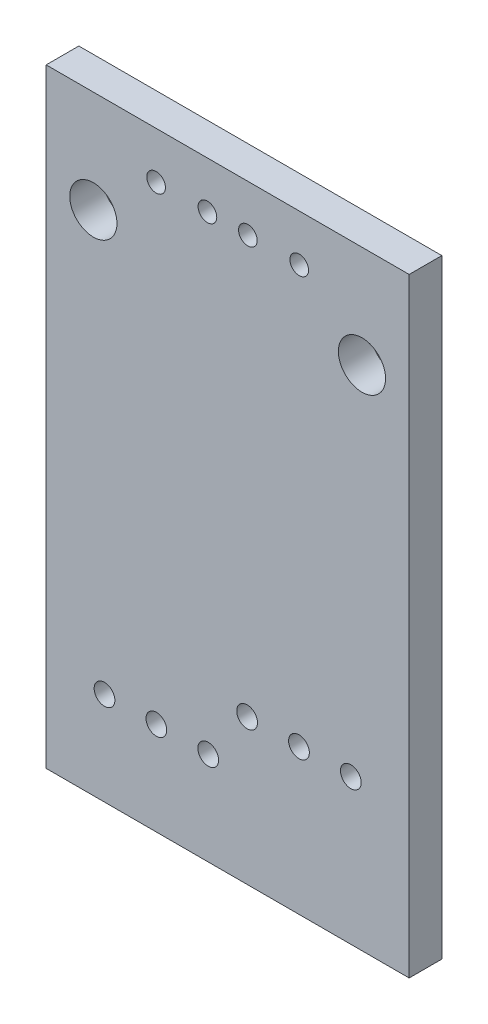
ISO-10303-21;
HEADER;
FILE_DESCRIPTION(('STEP AP214'),'2;1');
FILE_NAME('part.step','',(''),(''),'','','');
FILE_SCHEMA(('AUTOMOTIVE_DESIGN { 1 0 10303 214 1 1 1 1 }'));
ENDSEC;
DATA;
#1=APPLICATION_CONTEXT('core data for automotive mechanical design processes');
#2=APPLICATION_PROTOCOL_DEFINITION('international standard','automotive_design',2000,#1);
#3=PRODUCT_CONTEXT('',#1,'mechanical');
#4=PRODUCT('Part','Part','',(#3));
#5=PRODUCT_RELATED_PRODUCT_CATEGORY('part','',(#4));
#6=PRODUCT_DEFINITION_FORMATION('','',#4);
#7=PRODUCT_DEFINITION_CONTEXT('part definition',#1,'design');
#8=PRODUCT_DEFINITION('design','',#6,#7);
#9=PRODUCT_DEFINITION_SHAPE('','',#8);
#10=(LENGTH_UNIT() NAMED_UNIT(*) SI_UNIT(.MILLI.,.METRE.));
#11=(NAMED_UNIT(*) PLANE_ANGLE_UNIT() SI_UNIT($,.RADIAN.));
#12=(NAMED_UNIT(*) SI_UNIT($,.STERADIAN.) SOLID_ANGLE_UNIT());
#13=UNCERTAINTY_MEASURE_WITH_UNIT(LENGTH_MEASURE(1.E-05),#10,'distance_accuracy_value','');
#14=(GEOMETRIC_REPRESENTATION_CONTEXT(3) GLOBAL_UNCERTAINTY_ASSIGNED_CONTEXT((#13)) GLOBAL_UNIT_ASSIGNED_CONTEXT((#10,
#11,#12)) REPRESENTATION_CONTEXT('',''));
#15=CARTESIAN_POINT('',(0.,0.,0.));
#16=DIRECTION('',(0.,0.,1.));
#17=DIRECTION('',(1.,0.,0.));
#18=AXIS2_PLACEMENT_3D('',#15,#16,#17);
#19=CARTESIAN_POINT('',(8.89,14.9225,-0.8001));
#20=DIRECTION('',(0.,0.,-1.));
#21=DIRECTION('',(-1.,0.,0.));
#22=AXIS2_PLACEMENT_3D('',#19,#20,#21);
#23=PLANE('',#22);
#24=DIRECTION('',(0.,1.,0.));
#25=VECTOR('',#24,1.);
#26=CARTESIAN_POINT('',(-8.89,-14.9225,-0.8001));
#27=LINE('',#26,#25);
#28=CARTESIAN_POINT('',(-8.89,-14.9225,-0.8001));
#29=VERTEX_POINT('',#28);
#30=CARTESIAN_POINT('',(-8.89,14.9225,-0.8001));
#31=VERTEX_POINT('',#30);
#32=EDGE_CURVE('E56',#29,#31,#27,.T.);
#33=ORIENTED_EDGE('',*,*,#32,.T.);
#34=DIRECTION('',(1.,0.,0.));
#35=VECTOR('',#34,1.);
#36=CARTESIAN_POINT('',(-8.89,14.9225,-0.8001));
#37=LINE('',#36,#35);
#38=CARTESIAN_POINT('',(8.89,14.9225,-0.8001));
#39=VERTEX_POINT('',#38);
#40=EDGE_CURVE('E392',#31,#39,#37,.T.);
#41=ORIENTED_EDGE('',*,*,#40,.T.);
#42=DIRECTION('',(0.,1.,0.));
#43=VECTOR('',#42,1.);
#44=CARTESIAN_POINT('',(8.89,-14.9225,-0.8001));
#45=LINE('',#44,#43);
#46=CARTESIAN_POINT('',(8.89,-14.9225,-0.8001));
#47=VERTEX_POINT('',#46);
#48=EDGE_CURVE('E61',#39,#47,#45,.F.);
#49=ORIENTED_EDGE('',*,*,#48,.T.);
#50=DIRECTION('',(1.,0.,0.));
#51=VECTOR('',#50,1.);
#52=CARTESIAN_POINT('',(-8.89,-14.9225,-0.8001));
#53=LINE('',#52,#51);
#54=EDGE_CURVE('E59',#47,#29,#53,.F.);
#55=ORIENTED_EDGE('',*,*,#54,.T.);
#56=EDGE_LOOP('',(#33,#41,#49,#55));
#57=FACE_BOUND('',#56,.T.);
#58=CARTESIAN_POINT('',(0.990600000000001,12.6365,-0.8001));
#59=DIRECTION('',(0.,0.,1.));
#60=DIRECTION('',(1.,0.,0.));
#61=AXIS2_PLACEMENT_3D('',#58,#59,#60);
#62=CIRCLE('',#61,0.4572);
#63=CARTESIAN_POINT('',(1.4478,12.6365,-0.8001));
#64=VERTEX_POINT('',#63);
#65=EDGE_CURVE('E67',#64,#64,#62,.T.);
#66=ORIENTED_EDGE('',*,*,#65,.T.);
#67=EDGE_LOOP('',(#66));
#68=FACE_BOUND('',#67,.T.);
#69=CARTESIAN_POINT('',(3.5052,12.6365,-0.8001));
#70=DIRECTION('',(0.,0.,1.));
#71=DIRECTION('',(1.,0.,0.));
#72=AXIS2_PLACEMENT_3D('',#69,#70,#71);
#73=CIRCLE('',#72,0.457200000000001);
#74=CARTESIAN_POINT('',(3.9624,12.6365,-0.8001));
#75=VERTEX_POINT('',#74);
#76=EDGE_CURVE('E120',#75,#75,#73,.T.);
#77=ORIENTED_EDGE('',*,*,#76,.T.);
#78=EDGE_LOOP('',(#77));
#79=FACE_BOUND('',#78,.T.);
#80=CARTESIAN_POINT('',(-0.990599999999999,12.6365,-0.8001));
#81=DIRECTION('',(0.,0.,1.));
#82=DIRECTION('',(1.,0.,0.));
#83=AXIS2_PLACEMENT_3D('',#80,#81,#82);
#84=CIRCLE('',#83,0.4572);
#85=CARTESIAN_POINT('',(-0.533399999999999,12.6365,-0.8001));
#86=VERTEX_POINT('',#85);
#87=EDGE_CURVE('E123',#86,#86,#84,.T.);
#88=ORIENTED_EDGE('',*,*,#87,.T.);
#89=EDGE_LOOP('',(#88));
#90=FACE_BOUND('',#89,.T.);
#91=CARTESIAN_POINT('',(-3.5052,12.6365,-0.8001));
#92=DIRECTION('',(0.,0.,1.));
#93=DIRECTION('',(1.,0.,0.));
#94=AXIS2_PLACEMENT_3D('',#91,#92,#93);
#95=CIRCLE('',#94,0.4572);
#96=CARTESIAN_POINT('',(-3.048,12.6365,-0.8001));
#97=VERTEX_POINT('',#96);
#98=EDGE_CURVE('E126',#97,#97,#95,.T.);
#99=ORIENTED_EDGE('',*,*,#98,.T.);
#100=EDGE_LOOP('',(#99));
#101=FACE_BOUND('',#100,.T.);
#102=CARTESIAN_POINT('',(-6.5786,9.92649999999999,-0.8001));
#103=DIRECTION('',(0.,0.,1.));
#104=DIRECTION('',(1.,0.,0.));
#105=AXIS2_PLACEMENT_3D('',#102,#103,#104);
#106=CIRCLE('',#105,1.1557);
#107=CARTESIAN_POINT('',(-5.4229,9.92649999999999,-0.8001));
#108=VERTEX_POINT('',#107);
#109=EDGE_CURVE('E129',#108,#108,#106,.T.);
#110=ORIENTED_EDGE('',*,*,#109,.T.);
#111=EDGE_LOOP('',(#110));
#112=FACE_BOUND('',#111,.T.);
#113=CARTESIAN_POINT('',(6.5786,9.9265,-0.8001));
#114=DIRECTION('',(0.,0.,1.));
#115=DIRECTION('',(1.,0.,0.));
#116=AXIS2_PLACEMENT_3D('',#113,#114,#115);
#117=CIRCLE('',#116,1.1557);
#118=CARTESIAN_POINT('',(7.7343,9.9265,-0.8001));
#119=VERTEX_POINT('',#118);
#120=EDGE_CURVE('E132',#119,#119,#117,.T.);
#121=ORIENTED_EDGE('',*,*,#120,.T.);
#122=EDGE_LOOP('',(#121));
#123=FACE_BOUND('',#122,.T.);
#124=CARTESIAN_POINT('',(-6.0325,-10.3505,-0.8001));
#125=DIRECTION('',(0.,0.,1.));
#126=DIRECTION('',(1.,0.,0.));
#127=AXIS2_PLACEMENT_3D('',#124,#125,#126);
#128=CIRCLE('',#127,0.508);
#129=CARTESIAN_POINT('',(-5.5245,-10.3505,-0.8001));
#130=VERTEX_POINT('',#129);
#131=EDGE_CURVE('E135',#130,#130,#128,.T.);
#132=ORIENTED_EDGE('',*,*,#131,.T.);
#133=EDGE_LOOP('',(#132));
#134=FACE_BOUND('',#133,.T.);
#135=CARTESIAN_POINT('',(-3.4925,-10.3505,-0.8001));
#136=DIRECTION('',(0.,0.,1.));
#137=DIRECTION('',(1.,0.,0.));
#138=AXIS2_PLACEMENT_3D('',#135,#136,#137);
#139=CIRCLE('',#138,0.507999999999999);
#140=CARTESIAN_POINT('',(-2.9845,-10.3505,-0.8001));
#141=VERTEX_POINT('',#140);
#142=EDGE_CURVE('E138',#141,#141,#139,.T.);
#143=ORIENTED_EDGE('',*,*,#142,.T.);
#144=EDGE_LOOP('',(#143));
#145=FACE_BOUND('',#144,.T.);
#146=CARTESIAN_POINT('',(-0.952499999999996,-10.3505,-0.8001));
#147=DIRECTION('',(0.,0.,1.));
#148=DIRECTION('',(1.,0.,0.));
#149=AXIS2_PLACEMENT_3D('',#146,#147,#148);
#150=CIRCLE('',#149,0.507999999999999);
#151=CARTESIAN_POINT('',(-0.444499999999997,-10.3505,-0.8001));
#152=VERTEX_POINT('',#151);
#153=EDGE_CURVE('E141',#152,#152,#150,.T.);
#154=ORIENTED_EDGE('',*,*,#153,.T.);
#155=EDGE_LOOP('',(#154));
#156=FACE_BOUND('',#155,.T.);
#157=CARTESIAN_POINT('',(0.952500000000004,-7.8105,-0.8001));
#158=DIRECTION('',(0.,0.,1.));
#159=DIRECTION('',(1.,0.,0.));
#160=AXIS2_PLACEMENT_3D('',#157,#158,#159);
#161=CIRCLE('',#160,0.507999999999999);
#162=CARTESIAN_POINT('',(1.4605,-7.8105,-0.8001));
#163=VERTEX_POINT('',#162);
#164=EDGE_CURVE('E144',#163,#163,#161,.T.);
#165=ORIENTED_EDGE('',*,*,#164,.T.);
#166=EDGE_LOOP('',(#165));
#167=FACE_BOUND('',#166,.T.);
#168=CARTESIAN_POINT('',(3.4925,-7.8105,-0.8001));
#169=DIRECTION('',(0.,0.,1.));
#170=DIRECTION('',(1.,0.,0.));
#171=AXIS2_PLACEMENT_3D('',#168,#169,#170);
#172=CIRCLE('',#171,0.508000000000002);
#173=CARTESIAN_POINT('',(4.00050000000001,-7.8105,-0.8001));
#174=VERTEX_POINT('',#173);
#175=EDGE_CURVE('E146',#174,#174,#172,.T.);
#176=ORIENTED_EDGE('',*,*,#175,.T.);
#177=EDGE_LOOP('',(#176));
#178=FACE_BOUND('',#177,.T.);
#179=CARTESIAN_POINT('',(6.03250000000001,-7.8105,-0.8001));
#180=DIRECTION('',(0.,0.,1.));
#181=DIRECTION('',(1.,0.,0.));
#182=AXIS2_PLACEMENT_3D('',#179,#180,#181);
#183=CIRCLE('',#182,0.507999999999999);
#184=CARTESIAN_POINT('',(6.5405,-7.8105,-0.8001));
#185=VERTEX_POINT('',#184);
#186=EDGE_CURVE('E21',#185,#185,#183,.T.);
#187=ORIENTED_EDGE('',*,*,#186,.T.);
#188=EDGE_LOOP('',(#187));
#189=FACE_BOUND('',#188,.T.);
#190=ADVANCED_FACE('F18',(#57,#68,#79,#90,#101,#112,#123,#134,#145,#156,#167,#178,#189),#23,.T.);
#191=CARTESIAN_POINT('',(6.03250000000001,-7.8105,-0.8001));
#192=DIRECTION('',(0.,0.,1.));
#193=DIRECTION('',(1.,0.,0.));
#194=AXIS2_PLACEMENT_3D('',#191,#192,#193);
#195=CYLINDRICAL_SURFACE('',#194,0.507999999999999);
#196=ORIENTED_EDGE('',*,*,#186,.F.);
#197=EDGE_LOOP('',(#196));
#198=FACE_BOUND('',#197,.T.);
#199=CARTESIAN_POINT('',(6.03250000000001,-7.8105,0.8001));
#200=DIRECTION('',(0.,0.,1.));
#201=DIRECTION('',(1.,0.,0.));
#202=AXIS2_PLACEMENT_3D('',#199,#200,#201);
#203=CIRCLE('',#202,0.507999999999999);
#204=CARTESIAN_POINT('',(6.5405,-7.8105,0.8001));
#205=VERTEX_POINT('',#204);
#206=EDGE_CURVE('E115',#205,#205,#203,.T.);
#207=ORIENTED_EDGE('',*,*,#206,.T.);
#208=EDGE_LOOP('',(#207));
#209=FACE_BOUND('',#208,.T.);
#210=ADVANCED_FACE('F154',(#198,#209),#195,.F.);
#211=CARTESIAN_POINT('',(3.4925,-7.8105,-0.8001));
#212=DIRECTION('',(0.,0.,1.));
#213=DIRECTION('',(1.,0.,0.));
#214=AXIS2_PLACEMENT_3D('',#211,#212,#213);
#215=CYLINDRICAL_SURFACE('',#214,0.508000000000002);
#216=ORIENTED_EDGE('',*,*,#175,.F.);
#217=EDGE_LOOP('',(#216));
#218=FACE_BOUND('',#217,.T.);
#219=CARTESIAN_POINT('',(3.4925,-7.8105,0.8001));
#220=DIRECTION('',(0.,0.,1.));
#221=DIRECTION('',(1.,0.,0.));
#222=AXIS2_PLACEMENT_3D('',#219,#220,#221);
#223=CIRCLE('',#222,0.508000000000002);
#224=CARTESIAN_POINT('',(4.00050000000001,-7.8105,0.8001));
#225=VERTEX_POINT('',#224);
#226=EDGE_CURVE('E112',#225,#225,#223,.T.);
#227=ORIENTED_EDGE('',*,*,#226,.T.);
#228=EDGE_LOOP('',(#227));
#229=FACE_BOUND('',#228,.T.);
#230=ADVANCED_FACE('F157',(#218,#229),#215,.F.);
#231=CARTESIAN_POINT('',(0.952500000000004,-7.8105,-0.8001));
#232=DIRECTION('',(0.,0.,1.));
#233=DIRECTION('',(1.,0.,0.));
#234=AXIS2_PLACEMENT_3D('',#231,#232,#233);
#235=CYLINDRICAL_SURFACE('',#234,0.507999999999999);
#236=ORIENTED_EDGE('',*,*,#164,.F.);
#237=EDGE_LOOP('',(#236));
#238=FACE_BOUND('',#237,.T.);
#239=CARTESIAN_POINT('',(0.952500000000004,-7.8105,0.8001));
#240=DIRECTION('',(0.,0.,1.));
#241=DIRECTION('',(1.,0.,0.));
#242=AXIS2_PLACEMENT_3D('',#239,#240,#241);
#243=CIRCLE('',#242,0.507999999999999);
#244=CARTESIAN_POINT('',(1.4605,-7.8105,0.8001));
#245=VERTEX_POINT('',#244);
#246=EDGE_CURVE('E109',#245,#245,#243,.T.);
#247=ORIENTED_EDGE('',*,*,#246,.T.);
#248=EDGE_LOOP('',(#247));
#249=FACE_BOUND('',#248,.T.);
#250=ADVANCED_FACE('F216',(#238,#249),#235,.F.);
#251=CARTESIAN_POINT('',(-0.952499999999996,-10.3505,-0.8001));
#252=DIRECTION('',(0.,0.,1.));
#253=DIRECTION('',(1.,0.,0.));
#254=AXIS2_PLACEMENT_3D('',#251,#252,#253);
#255=CYLINDRICAL_SURFACE('',#254,0.507999999999999);
#256=ORIENTED_EDGE('',*,*,#153,.F.);
#257=EDGE_LOOP('',(#256));
#258=FACE_BOUND('',#257,.T.);
#259=CARTESIAN_POINT('',(-0.952499999999996,-10.3505,0.8001));
#260=DIRECTION('',(0.,0.,1.));
#261=DIRECTION('',(1.,0.,0.));
#262=AXIS2_PLACEMENT_3D('',#259,#260,#261);
#263=CIRCLE('',#262,0.507999999999999);
#264=CARTESIAN_POINT('',(-0.444499999999997,-10.3505,0.8001));
#265=VERTEX_POINT('',#264);
#266=EDGE_CURVE('E106',#265,#265,#263,.T.);
#267=ORIENTED_EDGE('',*,*,#266,.T.);
#268=EDGE_LOOP('',(#267));
#269=FACE_BOUND('',#268,.T.);
#270=ADVANCED_FACE('F212',(#258,#269),#255,.F.);
#271=CARTESIAN_POINT('',(-3.4925,-10.3505,-0.8001));
#272=DIRECTION('',(0.,0.,1.));
#273=DIRECTION('',(1.,0.,0.));
#274=AXIS2_PLACEMENT_3D('',#271,#272,#273);
#275=CYLINDRICAL_SURFACE('',#274,0.507999999999999);
#276=ORIENTED_EDGE('',*,*,#142,.F.);
#277=EDGE_LOOP('',(#276));
#278=FACE_BOUND('',#277,.T.);
#279=CARTESIAN_POINT('',(-3.4925,-10.3505,0.8001));
#280=DIRECTION('',(0.,0.,1.));
#281=DIRECTION('',(1.,0.,0.));
#282=AXIS2_PLACEMENT_3D('',#279,#280,#281);
#283=CIRCLE('',#282,0.507999999999999);
#284=CARTESIAN_POINT('',(-2.9845,-10.3505,0.8001));
#285=VERTEX_POINT('',#284);
#286=EDGE_CURVE('E103',#285,#285,#283,.T.);
#287=ORIENTED_EDGE('',*,*,#286,.T.);
#288=EDGE_LOOP('',(#287));
#289=FACE_BOUND('',#288,.T.);
#290=ADVANCED_FACE('F208',(#278,#289),#275,.F.);
#291=CARTESIAN_POINT('',(-6.0325,-10.3505,-0.8001));
#292=DIRECTION('',(0.,0.,1.));
#293=DIRECTION('',(1.,0.,0.));
#294=AXIS2_PLACEMENT_3D('',#291,#292,#293);
#295=CYLINDRICAL_SURFACE('',#294,0.508);
#296=ORIENTED_EDGE('',*,*,#131,.F.);
#297=EDGE_LOOP('',(#296));
#298=FACE_BOUND('',#297,.T.);
#299=CARTESIAN_POINT('',(-6.0325,-10.3505,0.8001));
#300=DIRECTION('',(0.,0.,1.));
#301=DIRECTION('',(1.,0.,0.));
#302=AXIS2_PLACEMENT_3D('',#299,#300,#301);
#303=CIRCLE('',#302,0.508);
#304=CARTESIAN_POINT('',(-5.5245,-10.3505,0.8001));
#305=VERTEX_POINT('',#304);
#306=EDGE_CURVE('E100',#305,#305,#303,.T.);
#307=ORIENTED_EDGE('',*,*,#306,.T.);
#308=EDGE_LOOP('',(#307));
#309=FACE_BOUND('',#308,.T.);
#310=ADVANCED_FACE('F204',(#298,#309),#295,.F.);
#311=CARTESIAN_POINT('',(6.5786,9.9265,-0.8001));
#312=DIRECTION('',(0.,0.,1.));
#313=DIRECTION('',(1.,0.,0.));
#314=AXIS2_PLACEMENT_3D('',#311,#312,#313);
#315=CYLINDRICAL_SURFACE('',#314,1.1557);
#316=ORIENTED_EDGE('',*,*,#120,.F.);
#317=EDGE_LOOP('',(#316));
#318=FACE_BOUND('',#317,.T.);
#319=CARTESIAN_POINT('',(6.5786,9.9265,0.8001));
#320=DIRECTION('',(0.,0.,1.));
#321=DIRECTION('',(1.,0.,0.));
#322=AXIS2_PLACEMENT_3D('',#319,#320,#321);
#323=CIRCLE('',#322,1.1557);
#324=CARTESIAN_POINT('',(7.7343,9.9265,0.8001));
#325=VERTEX_POINT('',#324);
#326=EDGE_CURVE('E97',#325,#325,#323,.T.);
#327=ORIENTED_EDGE('',*,*,#326,.T.);
#328=EDGE_LOOP('',(#327));
#329=FACE_BOUND('',#328,.T.);
#330=ADVANCED_FACE('F200',(#318,#329),#315,.F.);
#331=CARTESIAN_POINT('',(-6.5786,9.92649999999999,-0.8001));
#332=DIRECTION('',(0.,0.,1.));
#333=DIRECTION('',(1.,0.,0.));
#334=AXIS2_PLACEMENT_3D('',#331,#332,#333);
#335=CYLINDRICAL_SURFACE('',#334,1.1557);
#336=ORIENTED_EDGE('',*,*,#109,.F.);
#337=EDGE_LOOP('',(#336));
#338=FACE_BOUND('',#337,.T.);
#339=CARTESIAN_POINT('',(-6.5786,9.92649999999999,0.8001));
#340=DIRECTION('',(0.,0.,1.));
#341=DIRECTION('',(1.,0.,0.));
#342=AXIS2_PLACEMENT_3D('',#339,#340,#341);
#343=CIRCLE('',#342,1.1557);
#344=CARTESIAN_POINT('',(-5.4229,9.92649999999999,0.8001));
#345=VERTEX_POINT('',#344);
#346=EDGE_CURVE('E94',#345,#345,#343,.T.);
#347=ORIENTED_EDGE('',*,*,#346,.T.);
#348=EDGE_LOOP('',(#347));
#349=FACE_BOUND('',#348,.T.);
#350=ADVANCED_FACE('F196',(#338,#349),#335,.F.);
#351=CARTESIAN_POINT('',(-3.5052,12.6365,-0.8001));
#352=DIRECTION('',(0.,0.,1.));
#353=DIRECTION('',(1.,0.,0.));
#354=AXIS2_PLACEMENT_3D('',#351,#352,#353);
#355=CYLINDRICAL_SURFACE('',#354,0.4572);
#356=ORIENTED_EDGE('',*,*,#98,.F.);
#357=EDGE_LOOP('',(#356));
#358=FACE_BOUND('',#357,.T.);
#359=CARTESIAN_POINT('',(-3.5052,12.6365,0.8001));
#360=DIRECTION('',(0.,0.,1.));
#361=DIRECTION('',(1.,0.,0.));
#362=AXIS2_PLACEMENT_3D('',#359,#360,#361);
#363=CIRCLE('',#362,0.4572);
#364=CARTESIAN_POINT('',(-3.048,12.6365,0.8001));
#365=VERTEX_POINT('',#364);
#366=EDGE_CURVE('E91',#365,#365,#363,.T.);
#367=ORIENTED_EDGE('',*,*,#366,.T.);
#368=EDGE_LOOP('',(#367));
#369=FACE_BOUND('',#368,.T.);
#370=ADVANCED_FACE('F192',(#358,#369),#355,.F.);
#371=CARTESIAN_POINT('',(-0.990599999999999,12.6365,-0.8001));
#372=DIRECTION('',(0.,0.,1.));
#373=DIRECTION('',(1.,0.,0.));
#374=AXIS2_PLACEMENT_3D('',#371,#372,#373);
#375=CYLINDRICAL_SURFACE('',#374,0.4572);
#376=ORIENTED_EDGE('',*,*,#87,.F.);
#377=EDGE_LOOP('',(#376));
#378=FACE_BOUND('',#377,.T.);
#379=CARTESIAN_POINT('',(-0.990599999999999,12.6365,0.8001));
#380=DIRECTION('',(0.,0.,1.));
#381=DIRECTION('',(1.,0.,0.));
#382=AXIS2_PLACEMENT_3D('',#379,#380,#381);
#383=CIRCLE('',#382,0.4572);
#384=CARTESIAN_POINT('',(-0.533399999999999,12.6365,0.8001));
#385=VERTEX_POINT('',#384);
#386=EDGE_CURVE('E88',#385,#385,#383,.T.);
#387=ORIENTED_EDGE('',*,*,#386,.T.);
#388=EDGE_LOOP('',(#387));
#389=FACE_BOUND('',#388,.T.);
#390=ADVANCED_FACE('F188',(#378,#389),#375,.F.);
#391=CARTESIAN_POINT('',(3.5052,12.6365,-0.8001));
#392=DIRECTION('',(0.,0.,1.));
#393=DIRECTION('',(1.,0.,0.));
#394=AXIS2_PLACEMENT_3D('',#391,#392,#393);
#395=CYLINDRICAL_SURFACE('',#394,0.457200000000001);
#396=ORIENTED_EDGE('',*,*,#76,.F.);
#397=EDGE_LOOP('',(#396));
#398=FACE_BOUND('',#397,.T.);
#399=CARTESIAN_POINT('',(3.5052,12.6365,0.8001));
#400=DIRECTION('',(0.,0.,1.));
#401=DIRECTION('',(1.,0.,0.));
#402=AXIS2_PLACEMENT_3D('',#399,#400,#401);
#403=CIRCLE('',#402,0.457200000000001);
#404=CARTESIAN_POINT('',(3.9624,12.6365,0.8001));
#405=VERTEX_POINT('',#404);
#406=EDGE_CURVE('E85',#405,#405,#403,.T.);
#407=ORIENTED_EDGE('',*,*,#406,.T.);
#408=EDGE_LOOP('',(#407));
#409=FACE_BOUND('',#408,.T.);
#410=ADVANCED_FACE('F184',(#398,#409),#395,.F.);
#411=CARTESIAN_POINT('',(0.990600000000001,12.6365,-0.8001));
#412=DIRECTION('',(0.,0.,1.));
#413=DIRECTION('',(1.,0.,0.));
#414=AXIS2_PLACEMENT_3D('',#411,#412,#413);
#415=CYLINDRICAL_SURFACE('',#414,0.4572);
#416=ORIENTED_EDGE('',*,*,#65,.F.);
#417=EDGE_LOOP('',(#416));
#418=FACE_BOUND('',#417,.T.);
#419=CARTESIAN_POINT('',(0.990600000000001,12.6365,0.8001));
#420=DIRECTION('',(0.,0.,1.));
#421=DIRECTION('',(1.,0.,0.));
#422=AXIS2_PLACEMENT_3D('',#419,#420,#421);
#423=CIRCLE('',#422,0.4572);
#424=CARTESIAN_POINT('',(1.4478,12.6365,0.8001));
#425=VERTEX_POINT('',#424);
#426=EDGE_CURVE('E82',#425,#425,#423,.T.);
#427=ORIENTED_EDGE('',*,*,#426,.T.);
#428=EDGE_LOOP('',(#427));
#429=FACE_BOUND('',#428,.T.);
#430=ADVANCED_FACE('F181',(#418,#429),#415,.F.);
#431=CARTESIAN_POINT('',(-8.89,-14.9225,0.8001));
#432=DIRECTION('',(0.,1.,0.));
#433=DIRECTION('',(0.,0.,1.));
#434=AXIS2_PLACEMENT_3D('',#431,#432,#433);
#435=PLANE('',#434);
#436=DIRECTION('',(0.,0.,1.));
#437=VECTOR('',#436,1.);
#438=CARTESIAN_POINT('',(8.89,-14.9225,0.8001));
#439=LINE('',#438,#437);
#440=CARTESIAN_POINT('',(8.89,-14.9225,0.8001));
#441=VERTEX_POINT('',#440);
#442=EDGE_CURVE('E400',#47,#441,#439,.T.);
#443=ORIENTED_EDGE('',*,*,#442,.T.);
#444=DIRECTION('',(-1.,0.,0.));
#445=VECTOR('',#444,1.);
#446=CARTESIAN_POINT('',(8.89,-14.9225,0.8001));
#447=LINE('',#446,#445);
#448=CARTESIAN_POINT('',(-8.89,-14.9225,0.8001));
#449=VERTEX_POINT('',#448);
#450=EDGE_CURVE('E78',#441,#449,#447,.T.);
#451=ORIENTED_EDGE('',*,*,#450,.T.);
#452=DIRECTION('',(0.,0.,-1.));
#453=VECTOR('',#452,1.);
#454=CARTESIAN_POINT('',(-8.89,-14.9225,0.8001));
#455=LINE('',#454,#453);
#456=EDGE_CURVE('E66',#449,#29,#455,.T.);
#457=ORIENTED_EDGE('',*,*,#456,.T.);
#458=ORIENTED_EDGE('',*,*,#54,.F.);
#459=EDGE_LOOP('',(#443,#451,#457,#458));
#460=FACE_BOUND('',#459,.T.);
#461=ADVANCED_FACE('F77',(#460),#435,.F.);
#462=CARTESIAN_POINT('',(-8.89,-14.9225,0.8001));
#463=DIRECTION('',(1.,0.,0.));
#464=DIRECTION('',(0.,0.,-1.));
#465=AXIS2_PLACEMENT_3D('',#462,#463,#464);
#466=PLANE('',#465);
#467=ORIENTED_EDGE('',*,*,#456,.F.);
#468=DIRECTION('',(0.,1.,0.));
#469=VECTOR('',#468,1.);
#470=CARTESIAN_POINT('',(-8.89,14.9225,0.8001));
#471=LINE('',#470,#469);
#472=CARTESIAN_POINT('',(-8.89,14.9225,0.8001));
#473=VERTEX_POINT('',#472);
#474=EDGE_CURVE('E393',#449,#473,#471,.T.);
#475=ORIENTED_EDGE('',*,*,#474,.T.);
#476=DIRECTION('',(0.,0.,-1.));
#477=VECTOR('',#476,1.);
#478=CARTESIAN_POINT('',(-8.89,14.9225,0.8001));
#479=LINE('',#478,#477);
#480=EDGE_CURVE('E74',#473,#31,#479,.T.);
#481=ORIENTED_EDGE('',*,*,#480,.T.);
#482=ORIENTED_EDGE('',*,*,#32,.F.);
#483=EDGE_LOOP('',(#467,#475,#481,#482));
#484=FACE_BOUND('',#483,.T.);
#485=ADVANCED_FACE('F71',(#484),#466,.F.);
#486=CARTESIAN_POINT('',(-8.89,14.9225,0.8001));
#487=DIRECTION('',(0.,-1.,0.));
#488=DIRECTION('',(0.,0.,-1.));
#489=AXIS2_PLACEMENT_3D('',#486,#487,#488);
#490=PLANE('',#489);
#491=ORIENTED_EDGE('',*,*,#480,.F.);
#492=DIRECTION('',(-1.,0.,0.));
#493=VECTOR('',#492,1.);
#494=CARTESIAN_POINT('',(8.89,14.9225,0.8001));
#495=LINE('',#494,#493);
#496=CARTESIAN_POINT('',(8.89,14.9225,0.8001));
#497=VERTEX_POINT('',#496);
#498=EDGE_CURVE('E27',#473,#497,#495,.F.);
#499=ORIENTED_EDGE('',*,*,#498,.T.);
#500=DIRECTION('',(0.,0.,1.));
#501=VECTOR('',#500,1.);
#502=CARTESIAN_POINT('',(8.89,14.9225,0.8001));
#503=LINE('',#502,#501);
#504=EDGE_CURVE('E35',#497,#39,#503,.F.);
#505=ORIENTED_EDGE('',*,*,#504,.T.);
#506=ORIENTED_EDGE('',*,*,#40,.F.);
#507=EDGE_LOOP('',(#491,#499,#505,#506));
#508=FACE_BOUND('',#507,.T.);
#509=ADVANCED_FACE('F169',(#508),#490,.F.);
#510=CARTESIAN_POINT('',(8.89,-14.9225,0.8001));
#511=DIRECTION('',(-1.,0.,0.));
#512=DIRECTION('',(0.,0.,1.));
#513=AXIS2_PLACEMENT_3D('',#510,#511,#512);
#514=PLANE('',#513);
#515=ORIENTED_EDGE('',*,*,#504,.F.);
#516=DIRECTION('',(0.,1.,0.));
#517=VECTOR('',#516,1.);
#518=CARTESIAN_POINT('',(8.89,14.9225,0.8001));
#519=LINE('',#518,#517);
#520=EDGE_CURVE('E11',#497,#441,#519,.F.);
#521=ORIENTED_EDGE('',*,*,#520,.T.);
#522=ORIENTED_EDGE('',*,*,#442,.F.);
#523=ORIENTED_EDGE('',*,*,#48,.F.);
#524=EDGE_LOOP('',(#515,#521,#522,#523));
#525=FACE_BOUND('',#524,.T.);
#526=ADVANCED_FACE('F162',(#525),#514,.F.);
#527=CARTESIAN_POINT('',(8.89,14.9225,0.8001));
#528=DIRECTION('',(0.,0.,-1.));
#529=DIRECTION('',(-1.,0.,0.));
#530=AXIS2_PLACEMENT_3D('',#527,#528,#529);
#531=PLANE('',#530);
#532=ORIENTED_EDGE('',*,*,#498,.F.);
#533=ORIENTED_EDGE('',*,*,#474,.F.);
#534=ORIENTED_EDGE('',*,*,#450,.F.);
#535=ORIENTED_EDGE('',*,*,#520,.F.);
#536=EDGE_LOOP('',(#532,#533,#534,#535));
#537=FACE_BOUND('',#536,.T.);
#538=ORIENTED_EDGE('',*,*,#426,.F.);
#539=EDGE_LOOP('',(#538));
#540=FACE_BOUND('',#539,.T.);
#541=ORIENTED_EDGE('',*,*,#406,.F.);
#542=EDGE_LOOP('',(#541));
#543=FACE_BOUND('',#542,.T.);
#544=ORIENTED_EDGE('',*,*,#386,.F.);
#545=EDGE_LOOP('',(#544));
#546=FACE_BOUND('',#545,.T.);
#547=ORIENTED_EDGE('',*,*,#366,.F.);
#548=EDGE_LOOP('',(#547));
#549=FACE_BOUND('',#548,.T.);
#550=ORIENTED_EDGE('',*,*,#346,.F.);
#551=EDGE_LOOP('',(#550));
#552=FACE_BOUND('',#551,.T.);
#553=ORIENTED_EDGE('',*,*,#326,.F.);
#554=EDGE_LOOP('',(#553));
#555=FACE_BOUND('',#554,.T.);
#556=ORIENTED_EDGE('',*,*,#306,.F.);
#557=EDGE_LOOP('',(#556));
#558=FACE_BOUND('',#557,.T.);
#559=ORIENTED_EDGE('',*,*,#286,.F.);
#560=EDGE_LOOP('',(#559));
#561=FACE_BOUND('',#560,.T.);
#562=ORIENTED_EDGE('',*,*,#266,.F.);
#563=EDGE_LOOP('',(#562));
#564=FACE_BOUND('',#563,.T.);
#565=ORIENTED_EDGE('',*,*,#246,.F.);
#566=EDGE_LOOP('',(#565));
#567=FACE_BOUND('',#566,.T.);
#568=ORIENTED_EDGE('',*,*,#226,.F.);
#569=EDGE_LOOP('',(#568));
#570=FACE_BOUND('',#569,.T.);
#571=ORIENTED_EDGE('',*,*,#206,.F.);
#572=EDGE_LOOP('',(#571));
#573=FACE_BOUND('',#572,.T.);
#574=ADVANCED_FACE('F160',(#537,#540,#543,#546,#549,#552,#555,#558,#561,#564,#567,#570,#573),
#531,.F.);
#575=CLOSED_SHELL('',(#190,#210,#230,#250,#270,#290,#310,#330,#350,#370,#390,#410,#430,#461,
#485,#509,#526,#574));
#576=MANIFOLD_SOLID_BREP('B1',#575);
#577=ADVANCED_BREP_SHAPE_REPRESENTATION('',(#18,#576),#14);
#578=SHAPE_DEFINITION_REPRESENTATION(#9,#577);
ENDSEC;
END-ISO-10303-21;
